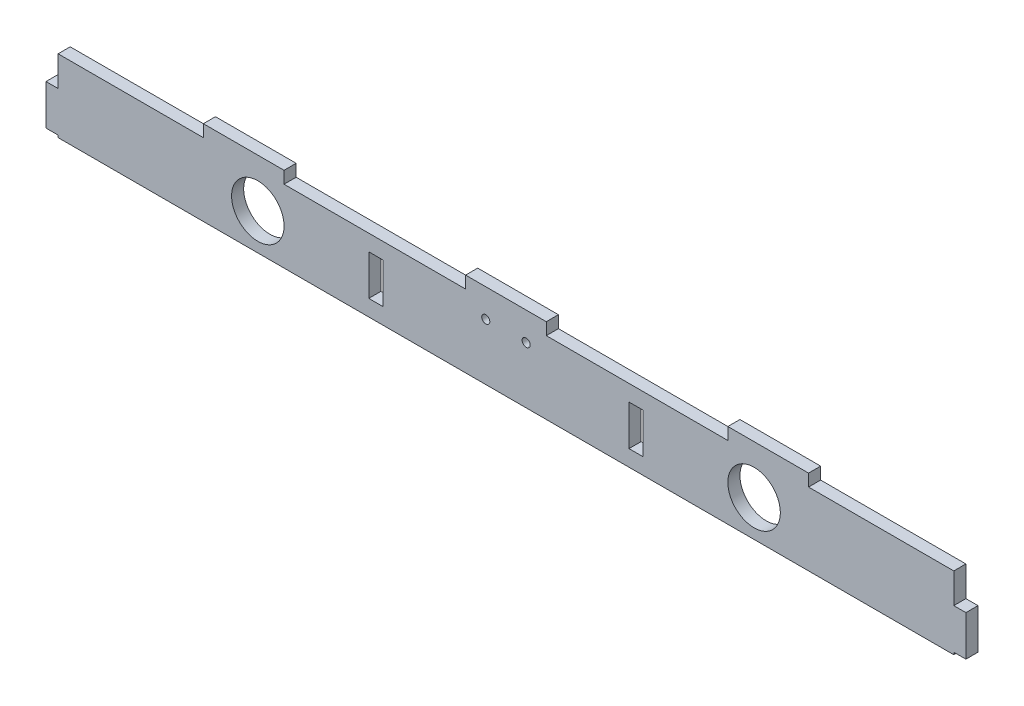
ISO-10303-21;
HEADER;
FILE_DESCRIPTION(('STEP AP214'),'2;1');
FILE_NAME('part.step','',(''),(''),'','','');
FILE_SCHEMA(('AUTOMOTIVE_DESIGN { 1 0 10303 214 1 1 1 1 }'));
ENDSEC;
DATA;
#1=APPLICATION_CONTEXT('core data for automotive mechanical design processes');
#2=APPLICATION_PROTOCOL_DEFINITION('international standard','automotive_design',2000,#1);
#3=PRODUCT_CONTEXT('',#1,'mechanical');
#4=PRODUCT('Part','Part','',(#3));
#5=PRODUCT_RELATED_PRODUCT_CATEGORY('part','',(#4));
#6=PRODUCT_DEFINITION_FORMATION('','',#4);
#7=PRODUCT_DEFINITION_CONTEXT('part definition',#1,'design');
#8=PRODUCT_DEFINITION('design','',#6,#7);
#9=PRODUCT_DEFINITION_SHAPE('','',#8);
#10=(LENGTH_UNIT() NAMED_UNIT(*) SI_UNIT(.MILLI.,.METRE.));
#11=(NAMED_UNIT(*) PLANE_ANGLE_UNIT() SI_UNIT($,.RADIAN.));
#12=(NAMED_UNIT(*) SI_UNIT($,.STERADIAN.) SOLID_ANGLE_UNIT());
#13=UNCERTAINTY_MEASURE_WITH_UNIT(LENGTH_MEASURE(1.E-05),#10,'distance_accuracy_value','');
#14=(GEOMETRIC_REPRESENTATION_CONTEXT(3) GLOBAL_UNCERTAINTY_ASSIGNED_CONTEXT((#13)) GLOBAL_UNIT_ASSIGNED_CONTEXT((#10,
#11,#12)) REPRESENTATION_CONTEXT('',''));
#15=CARTESIAN_POINT('',(0.,0.,0.));
#16=DIRECTION('',(0.,0.,1.));
#17=DIRECTION('',(1.,0.,0.));
#18=AXIS2_PLACEMENT_3D('',#15,#16,#17);
#19=CARTESIAN_POINT('',(-111.,-9.00000000000002,3.));
#20=DIRECTION('',(1.,0.,0.));
#21=DIRECTION('',(0.,0.,-1.));
#22=AXIS2_PLACEMENT_3D('',#19,#20,#21);
#23=PLANE('',#22);
#24=DIRECTION('',(0.,-1.,0.));
#25=VECTOR('',#24,1.);
#26=CARTESIAN_POINT('',(-111.,-9.00000000000002,0.));
#27=LINE('',#26,#25);
#28=CARTESIAN_POINT('',(-111.,8.99999999999998,0.));
#29=VERTEX_POINT('',#28);
#30=CARTESIAN_POINT('',(-111.,1.55,0.));
#31=VERTEX_POINT('',#30);
#32=EDGE_CURVE('E582',#29,#31,#27,.T.);
#33=ORIENTED_EDGE('',*,*,#32,.T.);
#34=DIRECTION('',(0.,0.,1.));
#35=VECTOR('',#34,1.);
#36=CARTESIAN_POINT('',(-111.,1.55,3.));
#37=LINE('',#36,#35);
#38=CARTESIAN_POINT('',(-111.,1.55,3.));
#39=VERTEX_POINT('',#38);
#40=EDGE_CURVE('E274',#31,#39,#37,.T.);
#41=ORIENTED_EDGE('',*,*,#40,.T.);
#42=DIRECTION('',(0.,-1.,0.));
#43=VECTOR('',#42,1.);
#44=CARTESIAN_POINT('',(-111.,-9.00000000000002,3.));
#45=LINE('',#44,#43);
#46=CARTESIAN_POINT('',(-111.,8.99999999999998,3.));
#47=VERTEX_POINT('',#46);
#48=EDGE_CURVE('E563',#47,#39,#45,.T.);
#49=ORIENTED_EDGE('',*,*,#48,.F.);
#50=DIRECTION('',(0.,0.,-1.));
#51=VECTOR('',#50,1.);
#52=CARTESIAN_POINT('',(-111.,8.99999999999998,3.));
#53=LINE('',#52,#51);
#54=EDGE_CURVE('E580',#47,#29,#53,.T.);
#55=ORIENTED_EDGE('',*,*,#54,.T.);
#56=EDGE_LOOP('',(#33,#41,#49,#55));
#57=FACE_BOUND('',#56,.T.);
#58=ADVANCED_FACE('F41',(#57),#23,.F.);
#59=CARTESIAN_POINT('',(111.,-8.99999999999999,3.));
#60=DIRECTION('',(-1.,0.,0.));
#61=DIRECTION('',(0.,0.,1.));
#62=AXIS2_PLACEMENT_3D('',#59,#60,#61);
#63=PLANE('',#62);
#64=DIRECTION('',(0.,0.,-1.));
#65=VECTOR('',#64,1.);
#66=CARTESIAN_POINT('',(111.,-8.45,3.));
#67=LINE('',#66,#65);
#68=CARTESIAN_POINT('',(111.,-8.45,3.));
#69=VERTEX_POINT('',#68);
#70=CARTESIAN_POINT('',(111.,-8.45,0.));
#71=VERTEX_POINT('',#70);
#72=EDGE_CURVE('E65',#69,#71,#67,.T.);
#73=ORIENTED_EDGE('',*,*,#72,.F.);
#74=DIRECTION('',(0.,1.,0.));
#75=VECTOR('',#74,1.);
#76=CARTESIAN_POINT('',(111.,-8.99999999999999,3.));
#77=LINE('',#76,#75);
#78=CARTESIAN_POINT('',(111.,-8.99999999999999,3.));
#79=VERTEX_POINT('',#78);
#80=EDGE_CURVE('E572',#79,#69,#77,.T.);
#81=ORIENTED_EDGE('',*,*,#80,.F.);
#82=DIRECTION('',(0.,0.,-1.));
#83=VECTOR('',#82,1.);
#84=CARTESIAN_POINT('',(111.,-8.99999999999999,3.));
#85=LINE('',#84,#83);
#86=CARTESIAN_POINT('',(111.,-8.99999999999999,0.));
#87=VERTEX_POINT('',#86);
#88=EDGE_CURVE('E50',#79,#87,#85,.T.);
#89=ORIENTED_EDGE('',*,*,#88,.T.);
#90=DIRECTION('',(0.,1.,0.));
#91=VECTOR('',#90,1.);
#92=CARTESIAN_POINT('',(111.,-8.99999999999999,0.));
#93=LINE('',#92,#91);
#94=EDGE_CURVE('E590',#87,#71,#93,.T.);
#95=ORIENTED_EDGE('',*,*,#94,.T.);
#96=EDGE_LOOP('',(#73,#81,#89,#95));
#97=FACE_BOUND('',#96,.T.);
#98=ADVANCED_FACE('F609',(#97),#63,.F.);
#99=DIRECTION('',(0.,0.,1.));
#100=VECTOR('',#99,1.);
#101=CARTESIAN_POINT('',(111.,1.55,3.));
#102=LINE('',#101,#100);
#103=CARTESIAN_POINT('',(111.,1.55,0.));
#104=VERTEX_POINT('',#103);
#105=CARTESIAN_POINT('',(111.,1.55,3.));
#106=VERTEX_POINT('',#105);
#107=EDGE_CURVE('E262',#104,#106,#102,.T.);
#108=ORIENTED_EDGE('',*,*,#107,.F.);
#109=CARTESIAN_POINT('',(111.,9.00000000000001,0.));
#110=VERTEX_POINT('',#109);
#111=EDGE_CURVE('E589',#104,#110,#93,.T.);
#112=ORIENTED_EDGE('',*,*,#111,.T.);
#113=DIRECTION('',(0.,0.,-1.));
#114=VECTOR('',#113,1.);
#115=CARTESIAN_POINT('',(111.,9.00000000000001,3.));
#116=LINE('',#115,#114);
#117=CARTESIAN_POINT('',(111.,9.00000000000001,3.));
#118=VERTEX_POINT('',#117);
#119=EDGE_CURVE('E601',#118,#110,#116,.T.);
#120=ORIENTED_EDGE('',*,*,#119,.F.);
#121=EDGE_CURVE('E571',#106,#118,#77,.T.);
#122=ORIENTED_EDGE('',*,*,#121,.F.);
#123=EDGE_LOOP('',(#108,#112,#120,#122));
#124=FACE_BOUND('',#123,.T.);
#125=ADVANCED_FACE('F797',(#124),#63,.F.);
#126=CARTESIAN_POINT('',(111.,9.00000000000001,3.));
#127=DIRECTION('',(0.,-1.,0.));
#128=DIRECTION('',(1.,0.,0.));
#129=AXIS2_PLACEMENT_3D('',#126,#127,#128);
#130=PLANE('',#129);
#131=DIRECTION('',(0.,0.,1.));
#132=VECTOR('',#131,1.);
#133=CARTESIAN_POINT('',(55.,9.,3.));
#134=LINE('',#133,#132);
#135=CARTESIAN_POINT('',(55.,9.,0.));
#136=VERTEX_POINT('',#135);
#137=CARTESIAN_POINT('',(55.,9.,3.));
#138=VERTEX_POINT('',#137);
#139=EDGE_CURVE('E355',#136,#138,#134,.T.);
#140=ORIENTED_EDGE('',*,*,#139,.F.);
#141=DIRECTION('',(-1.,0.,0.));
#142=VECTOR('',#141,1.);
#143=CARTESIAN_POINT('',(111.,9.00000000000001,0.));
#144=LINE('',#143,#142);
#145=CARTESIAN_POINT('',(10.,9.,0.));
#146=VERTEX_POINT('',#145);
#147=EDGE_CURVE('E597',#136,#146,#144,.T.);
#148=ORIENTED_EDGE('',*,*,#147,.T.);
#149=DIRECTION('',(0.,0.,-1.));
#150=VECTOR('',#149,1.);
#151=CARTESIAN_POINT('',(10.,9.,3.));
#152=LINE('',#151,#150);
#153=CARTESIAN_POINT('',(10.,9.,3.));
#154=VERTEX_POINT('',#153);
#155=EDGE_CURVE('E388',#154,#146,#152,.T.);
#156=ORIENTED_EDGE('',*,*,#155,.F.);
#157=DIRECTION('',(-1.,0.,0.));
#158=VECTOR('',#157,1.);
#159=CARTESIAN_POINT('',(111.,9.00000000000001,3.));
#160=LINE('',#159,#158);
#161=EDGE_CURVE('E581',#138,#154,#160,.T.);
#162=ORIENTED_EDGE('',*,*,#161,.F.);
#163=EDGE_LOOP('',(#140,#148,#156,#162));
#164=FACE_BOUND('',#163,.T.);
#165=ADVANCED_FACE('F745',(#164),#130,.F.);
#166=DIRECTION('',(0.,0.,-1.));
#167=VECTOR('',#166,1.);
#168=CARTESIAN_POINT('',(75.,9.00000000000001,3.));
#169=LINE('',#168,#167);
#170=CARTESIAN_POINT('',(75.0000000000001,9.00000000000001,3.));
#171=VERTEX_POINT('',#170);
#172=CARTESIAN_POINT('',(75.0000000000001,9.00000000000001,0.));
#173=VERTEX_POINT('',#172);
#174=EDGE_CURVE('E351',#171,#173,#169,.T.);
#175=ORIENTED_EDGE('',*,*,#174,.F.);
#176=EDGE_CURVE('E576',#118,#171,#160,.T.);
#177=ORIENTED_EDGE('',*,*,#176,.F.);
#178=ORIENTED_EDGE('',*,*,#119,.T.);
#179=EDGE_CURVE('E594',#110,#173,#144,.T.);
#180=ORIENTED_EDGE('',*,*,#179,.T.);
#181=EDGE_LOOP('',(#175,#177,#178,#180));
#182=FACE_BOUND('',#181,.T.);
#183=ADVANCED_FACE('F815',(#182),#130,.F.);
#184=DIRECTION('',(0.,0.,1.));
#185=VECTOR('',#184,1.);
#186=CARTESIAN_POINT('',(-9.99999999999997,8.99999999999999,3.));
#187=LINE('',#186,#185);
#188=CARTESIAN_POINT('',(-9.99999999999997,8.99999999999999,0.));
#189=VERTEX_POINT('',#188);
#190=CARTESIAN_POINT('',(-9.99999999999997,8.99999999999999,3.));
#191=VERTEX_POINT('',#190);
#192=EDGE_CURVE('E392',#189,#191,#187,.T.);
#193=ORIENTED_EDGE('',*,*,#192,.F.);
#194=CARTESIAN_POINT('',(-55.,8.99999999999999,0.));
#195=VERTEX_POINT('',#194);
#196=EDGE_CURVE('E715',#189,#195,#144,.T.);
#197=ORIENTED_EDGE('',*,*,#196,.T.);
#198=DIRECTION('',(0.,0.,-1.));
#199=VECTOR('',#198,1.);
#200=CARTESIAN_POINT('',(-55.,8.99999999999999,3.));
#201=LINE('',#200,#199);
#202=CARTESIAN_POINT('',(-55.,8.99999999999999,3.));
#203=VERTEX_POINT('',#202);
#204=EDGE_CURVE('E414',#203,#195,#201,.T.);
#205=ORIENTED_EDGE('',*,*,#204,.F.);
#206=EDGE_CURVE('E730',#191,#203,#160,.T.);
#207=ORIENTED_EDGE('',*,*,#206,.F.);
#208=EDGE_LOOP('',(#193,#197,#205,#207));
#209=FACE_BOUND('',#208,.T.);
#210=ADVANCED_FACE('F760',(#209),#130,.F.);
#211=DIRECTION('',(0.,0.,1.));
#212=VECTOR('',#211,1.);
#213=CARTESIAN_POINT('',(-75.,8.99999999999999,3.));
#214=LINE('',#213,#212);
#215=CARTESIAN_POINT('',(-75.,8.99999999999999,0.));
#216=VERTEX_POINT('',#215);
#217=CARTESIAN_POINT('',(-75.,8.99999999999999,3.));
#218=VERTEX_POINT('',#217);
#219=EDGE_CURVE('E397',#216,#218,#214,.T.);
#220=ORIENTED_EDGE('',*,*,#219,.F.);
#221=EDGE_CURVE('E593',#216,#29,#144,.T.);
#222=ORIENTED_EDGE('',*,*,#221,.T.);
#223=ORIENTED_EDGE('',*,*,#54,.F.);
#224=EDGE_CURVE('E575',#218,#47,#160,.T.);
#225=ORIENTED_EDGE('',*,*,#224,.F.);
#226=EDGE_LOOP('',(#220,#222,#223,#225));
#227=FACE_BOUND('',#226,.T.);
#228=ADVANCED_FACE('F775',(#227),#130,.F.);
#229=CARTESIAN_POINT('',(0.,0.,3.));
#230=DIRECTION('',(0.,0.,1.));
#231=DIRECTION('',(1.,0.,0.));
#232=AXIS2_PLACEMENT_3D('',#229,#230,#231);
#233=PLANE('',#232);
#234=DIRECTION('',(-1.,0.,0.));
#235=VECTOR('',#234,1.);
#236=CARTESIAN_POINT('',(34.,5.0000000000001,3.));
#237=LINE('',#236,#235);
#238=CARTESIAN_POINT('',(34.,5.0000000000001,3.));
#239=VERTEX_POINT('',#238);
#240=CARTESIAN_POINT('',(30.5,5.0000000000001,3.));
#241=VERTEX_POINT('',#240);
#242=EDGE_CURVE('E457',#239,#241,#237,.T.);
#243=ORIENTED_EDGE('',*,*,#242,.F.);
#244=DIRECTION('',(0.,1.,0.));
#245=VECTOR('',#244,1.);
#246=CARTESIAN_POINT('',(34.,5.0000000000001,3.));
#247=LINE('',#246,#245);
#248=CARTESIAN_POINT('',(34.,-4.9999999999999,3.));
#249=VERTEX_POINT('',#248);
#250=EDGE_CURVE('E454',#249,#239,#247,.T.);
#251=ORIENTED_EDGE('',*,*,#250,.F.);
#252=DIRECTION('',(1.,0.,0.));
#253=VECTOR('',#252,1.);
#254=CARTESIAN_POINT('',(34.,-4.9999999999999,3.));
#255=LINE('',#254,#253);
#256=CARTESIAN_POINT('',(30.5,-4.99999999999991,3.));
#257=VERTEX_POINT('',#256);
#258=EDGE_CURVE('E465',#257,#249,#255,.T.);
#259=ORIENTED_EDGE('',*,*,#258,.F.);
#260=DIRECTION('',(0.,-1.,0.));
#261=VECTOR('',#260,1.);
#262=CARTESIAN_POINT('',(30.5,5.0000000000001,3.));
#263=LINE('',#262,#261);
#264=EDGE_CURVE('E461',#241,#257,#263,.T.);
#265=ORIENTED_EDGE('',*,*,#264,.F.);
#266=EDGE_LOOP('',(#243,#251,#259,#265));
#267=FACE_BOUND('',#266,.T.);
#268=CARTESIAN_POINT('',(5.00000000000002,5.00000000000002,3.));
#269=DIRECTION('',(0.,0.,1.));
#270=DIRECTION('',(-1.,0.,0.));
#271=AXIS2_PLACEMENT_3D('',#268,#269,#270);
#272=CIRCLE('',#271,0.999999999999999);
#273=CARTESIAN_POINT('',(4.00000000000002,5.00000000000002,3.));
#274=VERTEX_POINT('',#273);
#275=EDGE_CURVE('E497',#274,#274,#272,.T.);
#276=ORIENTED_EDGE('',*,*,#275,.F.);
#277=EDGE_LOOP('',(#276));
#278=FACE_BOUND('',#277,.T.);
#279=DIRECTION('',(-1.,0.,0.));
#280=VECTOR('',#279,1.);
#281=CARTESIAN_POINT('',(-34.,5.,3.));
#282=LINE('',#281,#280);
#283=CARTESIAN_POINT('',(-30.5,5.,3.));
#284=VERTEX_POINT('',#283);
#285=CARTESIAN_POINT('',(-34.,5.,3.));
#286=VERTEX_POINT('',#285);
#287=EDGE_CURVE('E516',#284,#286,#282,.T.);
#288=ORIENTED_EDGE('',*,*,#287,.F.);
#289=DIRECTION('',(0.,1.,0.));
#290=VECTOR('',#289,1.);
#291=CARTESIAN_POINT('',(-30.5,5.,3.));
#292=LINE('',#291,#290);
#293=CARTESIAN_POINT('',(-30.5,-5.,3.));
#294=VERTEX_POINT('',#293);
#295=EDGE_CURVE('E513',#294,#284,#292,.T.);
#296=ORIENTED_EDGE('',*,*,#295,.F.);
#297=DIRECTION('',(1.,0.,0.));
#298=VECTOR('',#297,1.);
#299=CARTESIAN_POINT('',(-34.,-5.,3.));
#300=LINE('',#299,#298);
#301=CARTESIAN_POINT('',(-34.,-5.,3.));
#302=VERTEX_POINT('',#301);
#303=EDGE_CURVE('E524',#302,#294,#300,.T.);
#304=ORIENTED_EDGE('',*,*,#303,.F.);
#305=DIRECTION('',(0.,-1.,0.));
#306=VECTOR('',#305,1.);
#307=CARTESIAN_POINT('',(-34.,5.,3.));
#308=LINE('',#307,#306);
#309=EDGE_CURVE('E520',#286,#302,#308,.T.);
#310=ORIENTED_EDGE('',*,*,#309,.F.);
#311=EDGE_LOOP('',(#288,#296,#304,#310));
#312=FACE_BOUND('',#311,.T.);
#313=CARTESIAN_POINT('',(-5.,5.,3.));
#314=DIRECTION('',(0.,0.,1.));
#315=DIRECTION('',(1.,0.,0.));
#316=AXIS2_PLACEMENT_3D('',#313,#314,#315);
#317=CIRCLE('',#316,1.);
#318=CARTESIAN_POINT('',(-4.,5.,3.));
#319=VERTEX_POINT('',#318);
#320=EDGE_CURVE('E556',#319,#319,#317,.T.);
#321=ORIENTED_EDGE('',*,*,#320,.F.);
#322=EDGE_LOOP('',(#321));
#323=FACE_BOUND('',#322,.T.);
#324=ORIENTED_EDGE('',*,*,#48,.T.);
#325=DIRECTION('',(1.,0.,0.));
#326=VECTOR('',#325,1.);
#327=CARTESIAN_POINT('',(-114.,1.55,3.));
#328=LINE('',#327,#326);
#329=CARTESIAN_POINT('',(-114.,1.55,3.));
#330=VERTEX_POINT('',#329);
#331=EDGE_CURVE('E295',#330,#39,#328,.T.);
#332=ORIENTED_EDGE('',*,*,#331,.F.);
#333=DIRECTION('',(0.,-1.,0.));
#334=VECTOR('',#333,1.);
#335=CARTESIAN_POINT('',(-114.,-8.45,3.));
#336=LINE('',#335,#334);
#337=CARTESIAN_POINT('',(-114.,-8.45,3.));
#338=VERTEX_POINT('',#337);
#339=EDGE_CURVE('E278',#330,#338,#336,.T.);
#340=ORIENTED_EDGE('',*,*,#339,.T.);
#341=DIRECTION('',(1.,0.,0.));
#342=VECTOR('',#341,1.);
#343=CARTESIAN_POINT('',(-114.,-8.45,3.));
#344=LINE('',#343,#342);
#345=CARTESIAN_POINT('',(-111.,-8.45,3.));
#346=VERTEX_POINT('',#345);
#347=EDGE_CURVE('E263',#338,#346,#344,.T.);
#348=ORIENTED_EDGE('',*,*,#347,.T.);
#349=CARTESIAN_POINT('',(-111.,-9.00000000000002,3.));
#350=VERTEX_POINT('',#349);
#351=EDGE_CURVE('E568',#346,#350,#45,.T.);
#352=ORIENTED_EDGE('',*,*,#351,.T.);
#353=DIRECTION('',(1.,0.,0.));
#354=VECTOR('',#353,1.);
#355=CARTESIAN_POINT('',(111.,-8.99999999999999,3.));
#356=LINE('',#355,#354);
#357=EDGE_CURVE('E567',#350,#79,#356,.T.);
#358=ORIENTED_EDGE('',*,*,#357,.T.);
#359=ORIENTED_EDGE('',*,*,#80,.T.);
#360=DIRECTION('',(-1.,0.,0.));
#361=VECTOR('',#360,1.);
#362=CARTESIAN_POINT('',(114.,-8.45,3.));
#363=LINE('',#362,#361);
#364=CARTESIAN_POINT('',(114.,-8.45,3.));
#365=VERTEX_POINT('',#364);
#366=EDGE_CURVE('E322',#365,#69,#363,.T.);
#367=ORIENTED_EDGE('',*,*,#366,.F.);
#368=DIRECTION('',(0.,-1.,0.));
#369=VECTOR('',#368,1.);
#370=CARTESIAN_POINT('',(114.,-8.45,3.));
#371=LINE('',#370,#369);
#372=CARTESIAN_POINT('',(114.,1.55,3.));
#373=VERTEX_POINT('',#372);
#374=EDGE_CURVE('E307',#373,#365,#371,.T.);
#375=ORIENTED_EDGE('',*,*,#374,.F.);
#376=DIRECTION('',(-1.,0.,0.));
#377=VECTOR('',#376,1.);
#378=CARTESIAN_POINT('',(114.,1.55,3.));
#379=LINE('',#378,#377);
#380=EDGE_CURVE('E326',#373,#106,#379,.T.);
#381=ORIENTED_EDGE('',*,*,#380,.T.);
#382=ORIENTED_EDGE('',*,*,#121,.T.);
#383=ORIENTED_EDGE('',*,*,#176,.T.);
#384=DIRECTION('',(0.,-1.,0.));
#385=VECTOR('',#384,1.);
#386=CARTESIAN_POINT('',(75.,12.,3.));
#387=LINE('',#386,#385);
#388=CARTESIAN_POINT('',(75.,12.,3.));
#389=VERTEX_POINT('',#388);
#390=EDGE_CURVE('E342',#389,#171,#387,.T.);
#391=ORIENTED_EDGE('',*,*,#390,.F.);
#392=DIRECTION('',(1.,0.,0.));
#393=VECTOR('',#392,1.);
#394=CARTESIAN_POINT('',(75.,12.,3.));
#395=LINE('',#394,#393);
#396=CARTESIAN_POINT('',(55.,12.,3.));
#397=VERTEX_POINT('',#396);
#398=EDGE_CURVE('E363',#397,#389,#395,.T.);
#399=ORIENTED_EDGE('',*,*,#398,.F.);
#400=DIRECTION('',(0.,-1.,0.));
#401=VECTOR('',#400,1.);
#402=CARTESIAN_POINT('',(55.,12.,3.));
#403=LINE('',#402,#401);
#404=EDGE_CURVE('E338',#397,#138,#403,.T.);
#405=ORIENTED_EDGE('',*,*,#404,.T.);
#406=ORIENTED_EDGE('',*,*,#161,.T.);
#407=DIRECTION('',(0.,-1.,0.));
#408=VECTOR('',#407,1.);
#409=CARTESIAN_POINT('',(10.,12.,3.));
#410=LINE('',#409,#408);
#411=CARTESIAN_POINT('',(10.,12.,3.));
#412=VERTEX_POINT('',#411);
#413=EDGE_CURVE('E379',#412,#154,#410,.T.);
#414=ORIENTED_EDGE('',*,*,#413,.F.);
#415=DIRECTION('',(1.,0.,0.));
#416=VECTOR('',#415,1.);
#417=CARTESIAN_POINT('',(10.,12.,3.));
#418=LINE('',#417,#416);
#419=CARTESIAN_POINT('',(-9.99999999999997,12.,3.));
#420=VERTEX_POINT('',#419);
#421=EDGE_CURVE('E400',#420,#412,#418,.T.);
#422=ORIENTED_EDGE('',*,*,#421,.F.);
#423=DIRECTION('',(0.,-1.,0.));
#424=VECTOR('',#423,1.);
#425=CARTESIAN_POINT('',(-9.99999999999997,12.,3.));
#426=LINE('',#425,#424);
#427=EDGE_CURVE('E375',#420,#191,#426,.T.);
#428=ORIENTED_EDGE('',*,*,#427,.T.);
#429=ORIENTED_EDGE('',*,*,#206,.T.);
#430=DIRECTION('',(0.,-1.,0.));
#431=VECTOR('',#430,1.);
#432=CARTESIAN_POINT('',(-55.,12.,3.));
#433=LINE('',#432,#431);
#434=CARTESIAN_POINT('',(-55.,12.,3.));
#435=VERTEX_POINT('',#434);
#436=EDGE_CURVE('E433',#435,#203,#433,.T.);
#437=ORIENTED_EDGE('',*,*,#436,.F.);
#438=DIRECTION('',(1.,0.,0.));
#439=VECTOR('',#438,1.);
#440=CARTESIAN_POINT('',(-55.,12.,3.));
#441=LINE('',#440,#439);
#442=CARTESIAN_POINT('',(-75.,12.,3.));
#443=VERTEX_POINT('',#442);
#444=EDGE_CURVE('E417',#443,#435,#441,.T.);
#445=ORIENTED_EDGE('',*,*,#444,.F.);
#446=DIRECTION('',(0.,-1.,0.));
#447=VECTOR('',#446,1.);
#448=CARTESIAN_POINT('',(-75.,12.,3.));
#449=LINE('',#448,#447);
#450=EDGE_CURVE('E437',#443,#218,#449,.T.);
#451=ORIENTED_EDGE('',*,*,#450,.T.);
#452=ORIENTED_EDGE('',*,*,#224,.T.);
#453=EDGE_LOOP('',(#324,#332,#340,#348,#352,#358,#359,#367,#375,#381,#382,#383,#391,#399,#405,
#406,#414,#422,#428,#429,#437,#445,#451,#452));
#454=FACE_BOUND('',#453,.T.);
#455=CARTESIAN_POINT('',(-61.5,0.,3.));
#456=DIRECTION('',(0.,0.,1.));
#457=DIRECTION('',(1.,0.,0.));
#458=AXIS2_PLACEMENT_3D('',#455,#456,#457);
#459=CIRCLE('',#458,6.5);
#460=CARTESIAN_POINT('',(-55.,0.,3.));
#461=VERTEX_POINT('',#460);
#462=EDGE_CURVE('E505',#461,#461,#459,.T.);
#463=ORIENTED_EDGE('',*,*,#462,.F.);
#464=EDGE_LOOP('',(#463));
#465=FACE_BOUND('',#464,.T.);
#466=CARTESIAN_POINT('',(61.5,1.89663100040131E-13,3.));
#467=DIRECTION('',(0.,0.,1.));
#468=DIRECTION('',(-1.,0.,0.));
#469=AXIS2_PLACEMENT_3D('',#466,#467,#468);
#470=CIRCLE('',#469,6.5);
#471=CARTESIAN_POINT('',(55.,1.89663100040131E-13,3.));
#472=VERTEX_POINT('',#471);
#473=EDGE_CURVE('E446',#472,#472,#470,.T.);
#474=ORIENTED_EDGE('',*,*,#473,.F.);
#475=EDGE_LOOP('',(#474));
#476=FACE_BOUND('',#475,.T.);
#477=ADVANCED_FACE('F621',(#267,#278,#312,#323,#454,#465,#476),#233,.T.);
#478=CARTESIAN_POINT('',(0.,0.,0.));
#479=DIRECTION('',(0.,0.,1.));
#480=DIRECTION('',(1.,0.,0.));
#481=AXIS2_PLACEMENT_3D('',#478,#479,#480);
#482=PLANE('',#481);
#483=CARTESIAN_POINT('',(5.00000000000002,5.00000000000002,0.));
#484=DIRECTION('',(0.,0.,1.));
#485=DIRECTION('',(-1.,0.,0.));
#486=AXIS2_PLACEMENT_3D('',#483,#484,#485);
#487=CIRCLE('',#486,0.999999999999999);
#488=CARTESIAN_POINT('',(4.00000000000002,5.00000000000002,0.));
#489=VERTEX_POINT('',#488);
#490=EDGE_CURVE('E496',#489,#489,#487,.T.);
#491=ORIENTED_EDGE('',*,*,#490,.T.);
#492=EDGE_LOOP('',(#491));
#493=FACE_BOUND('',#492,.T.);
#494=CARTESIAN_POINT('',(-61.5,0.,0.));
#495=DIRECTION('',(0.,0.,1.));
#496=DIRECTION('',(1.,0.,0.));
#497=AXIS2_PLACEMENT_3D('',#494,#495,#496);
#498=CIRCLE('',#497,6.5);
#499=CARTESIAN_POINT('',(-55.,0.,0.));
#500=VERTEX_POINT('',#499);
#501=EDGE_CURVE('E501',#500,#500,#498,.T.);
#502=ORIENTED_EDGE('',*,*,#501,.T.);
#503=EDGE_LOOP('',(#502));
#504=FACE_BOUND('',#503,.T.);
#505=DIRECTION('',(0.,1.,0.));
#506=VECTOR('',#505,1.);
#507=CARTESIAN_POINT('',(-30.5,5.,0.));
#508=LINE('',#507,#506);
#509=CARTESIAN_POINT('',(-30.5,-5.,0.));
#510=VERTEX_POINT('',#509);
#511=CARTESIAN_POINT('',(-30.5,5.,0.));
#512=VERTEX_POINT('',#511);
#513=EDGE_CURVE('E509',#510,#512,#508,.T.);
#514=ORIENTED_EDGE('',*,*,#513,.T.);
#515=DIRECTION('',(-1.,0.,0.));
#516=VECTOR('',#515,1.);
#517=CARTESIAN_POINT('',(-34.,5.,0.));
#518=LINE('',#517,#516);
#519=CARTESIAN_POINT('',(-34.,5.,0.));
#520=VERTEX_POINT('',#519);
#521=EDGE_CURVE('E531',#512,#520,#518,.T.);
#522=ORIENTED_EDGE('',*,*,#521,.T.);
#523=DIRECTION('',(0.,-1.,0.));
#524=VECTOR('',#523,1.);
#525=CARTESIAN_POINT('',(-34.,5.,0.));
#526=LINE('',#525,#524);
#527=CARTESIAN_POINT('',(-34.,-5.,0.));
#528=VERTEX_POINT('',#527);
#529=EDGE_CURVE('E535',#520,#528,#526,.T.);
#530=ORIENTED_EDGE('',*,*,#529,.T.);
#531=DIRECTION('',(1.,0.,0.));
#532=VECTOR('',#531,1.);
#533=CARTESIAN_POINT('',(-34.,-5.,0.));
#534=LINE('',#533,#532);
#535=EDGE_CURVE('E517',#528,#510,#534,.T.);
#536=ORIENTED_EDGE('',*,*,#535,.T.);
#537=EDGE_LOOP('',(#514,#522,#530,#536));
#538=FACE_BOUND('',#537,.T.);
#539=ORIENTED_EDGE('',*,*,#32,.F.);
#540=ORIENTED_EDGE('',*,*,#221,.F.);
#541=DIRECTION('',(0.,-1.,0.));
#542=VECTOR('',#541,1.);
#543=CARTESIAN_POINT('',(-75.,12.,0.));
#544=LINE('',#543,#542);
#545=CARTESIAN_POINT('',(-75.,12.,0.));
#546=VERTEX_POINT('',#545);
#547=EDGE_CURVE('E441',#546,#216,#544,.T.);
#548=ORIENTED_EDGE('',*,*,#547,.F.);
#549=DIRECTION('',(-1.,0.,0.));
#550=VECTOR('',#549,1.);
#551=CARTESIAN_POINT('',(-55.,12.,0.));
#552=LINE('',#551,#550);
#553=CARTESIAN_POINT('',(-55.,12.,0.));
#554=VERTEX_POINT('',#553);
#555=EDGE_CURVE('E409',#554,#546,#552,.T.);
#556=ORIENTED_EDGE('',*,*,#555,.F.);
#557=DIRECTION('',(0.,-1.,0.));
#558=VECTOR('',#557,1.);
#559=CARTESIAN_POINT('',(-55.,12.,0.));
#560=LINE('',#559,#558);
#561=EDGE_CURVE('E423',#554,#195,#560,.T.);
#562=ORIENTED_EDGE('',*,*,#561,.T.);
#563=ORIENTED_EDGE('',*,*,#196,.F.);
#564=DIRECTION('',(0.,-1.,0.));
#565=VECTOR('',#564,1.);
#566=CARTESIAN_POINT('',(-9.99999999999997,12.,0.));
#567=LINE('',#566,#565);
#568=CARTESIAN_POINT('',(-9.99999999999997,12.,0.));
#569=VERTEX_POINT('',#568);
#570=EDGE_CURVE('E360',#569,#189,#567,.T.);
#571=ORIENTED_EDGE('',*,*,#570,.F.);
#572=DIRECTION('',(-1.,0.,0.));
#573=VECTOR('',#572,1.);
#574=CARTESIAN_POINT('',(10.,12.,0.));
#575=LINE('',#574,#573);
#576=CARTESIAN_POINT('',(10.,12.,0.));
#577=VERTEX_POINT('',#576);
#578=EDGE_CURVE('E393',#577,#569,#575,.T.);
#579=ORIENTED_EDGE('',*,*,#578,.F.);
#580=DIRECTION('',(0.,-1.,0.));
#581=VECTOR('',#580,1.);
#582=CARTESIAN_POINT('',(10.,12.,0.));
#583=LINE('',#582,#581);
#584=EDGE_CURVE('E383',#577,#146,#583,.T.);
#585=ORIENTED_EDGE('',*,*,#584,.T.);
#586=ORIENTED_EDGE('',*,*,#147,.F.);
#587=DIRECTION('',(0.,-1.,0.));
#588=VECTOR('',#587,1.);
#589=CARTESIAN_POINT('',(55.,12.,0.));
#590=LINE('',#589,#588);
#591=CARTESIAN_POINT('',(55.,12.,0.));
#592=VERTEX_POINT('',#591);
#593=EDGE_CURVE('E334',#592,#136,#590,.T.);
#594=ORIENTED_EDGE('',*,*,#593,.F.);
#595=DIRECTION('',(-1.,0.,0.));
#596=VECTOR('',#595,1.);
#597=CARTESIAN_POINT('',(75.0000000000001,12.,0.));
#598=LINE('',#597,#596);
#599=CARTESIAN_POINT('',(75.0000000000001,12.,0.));
#600=VERTEX_POINT('',#599);
#601=EDGE_CURVE('E356',#600,#592,#598,.T.);
#602=ORIENTED_EDGE('',*,*,#601,.F.);
#603=DIRECTION('',(0.,-1.,0.));
#604=VECTOR('',#603,1.);
#605=CARTESIAN_POINT('',(75.0000000000001,12.,0.));
#606=LINE('',#605,#604);
#607=EDGE_CURVE('E346',#600,#173,#606,.T.);
#608=ORIENTED_EDGE('',*,*,#607,.T.);
#609=ORIENTED_EDGE('',*,*,#179,.F.);
#610=ORIENTED_EDGE('',*,*,#111,.F.);
#611=DIRECTION('',(-1.,0.,0.));
#612=VECTOR('',#611,1.);
#613=CARTESIAN_POINT('',(114.,1.55,0.));
#614=LINE('',#613,#612);
#615=CARTESIAN_POINT('',(114.,1.55,0.));
#616=VERTEX_POINT('',#615);
#617=EDGE_CURVE('E330',#616,#104,#614,.T.);
#618=ORIENTED_EDGE('',*,*,#617,.F.);
#619=DIRECTION('',(0.,1.,0.));
#620=VECTOR('',#619,1.);
#621=CARTESIAN_POINT('',(114.,-8.45,0.));
#622=LINE('',#621,#620);
#623=CARTESIAN_POINT('',(114.,-8.45,0.));
#624=VERTEX_POINT('',#623);
#625=EDGE_CURVE('E300',#624,#616,#622,.T.);
#626=ORIENTED_EDGE('',*,*,#625,.F.);
#627=DIRECTION('',(-1.,0.,0.));
#628=VECTOR('',#627,1.);
#629=CARTESIAN_POINT('',(114.,-8.45,0.));
#630=LINE('',#629,#628);
#631=EDGE_CURVE('E313',#624,#71,#630,.T.);
#632=ORIENTED_EDGE('',*,*,#631,.T.);
#633=ORIENTED_EDGE('',*,*,#94,.F.);
#634=DIRECTION('',(1.,0.,0.));
#635=VECTOR('',#634,1.);
#636=CARTESIAN_POINT('',(111.,-8.99999999999999,0.));
#637=LINE('',#636,#635);
#638=CARTESIAN_POINT('',(-111.,-9.00000000000002,0.));
#639=VERTEX_POINT('',#638);
#640=EDGE_CURVE('E586',#639,#87,#637,.T.);
#641=ORIENTED_EDGE('',*,*,#640,.F.);
#642=CARTESIAN_POINT('',(-111.,-8.45,0.));
#643=VERTEX_POINT('',#642);
#644=EDGE_CURVE('E260',#643,#639,#27,.T.);
#645=ORIENTED_EDGE('',*,*,#644,.F.);
#646=DIRECTION('',(1.,0.,0.));
#647=VECTOR('',#646,1.);
#648=CARTESIAN_POINT('',(-114.,-8.45,0.));
#649=LINE('',#648,#647);
#650=CARTESIAN_POINT('',(-114.,-8.45,0.));
#651=VERTEX_POINT('',#650);
#652=EDGE_CURVE('E57',#651,#643,#649,.T.);
#653=ORIENTED_EDGE('',*,*,#652,.F.);
#654=DIRECTION('',(0.,1.,0.));
#655=VECTOR('',#654,1.);
#656=CARTESIAN_POINT('',(-114.,-8.45,0.));
#657=LINE('',#656,#655);
#658=CARTESIAN_POINT('',(-114.,1.55,0.));
#659=VERTEX_POINT('',#658);
#660=EDGE_CURVE('E257',#651,#659,#657,.T.);
#661=ORIENTED_EDGE('',*,*,#660,.T.);
#662=DIRECTION('',(1.,0.,0.));
#663=VECTOR('',#662,1.);
#664=CARTESIAN_POINT('',(-114.,1.55,0.));
#665=LINE('',#664,#663);
#666=EDGE_CURVE('E286',#659,#31,#665,.T.);
#667=ORIENTED_EDGE('',*,*,#666,.T.);
#668=EDGE_LOOP('',(#539,#540,#548,#556,#562,#563,#571,#579,#585,#586,#594,#602,#608,#609,#610,
#618,#626,#632,#633,#641,#645,#653,#661,#667));
#669=FACE_BOUND('',#668,.T.);
#670=CARTESIAN_POINT('',(-5.,5.,0.));
#671=DIRECTION('',(0.,0.,1.));
#672=DIRECTION('',(1.,0.,0.));
#673=AXIS2_PLACEMENT_3D('',#670,#671,#672);
#674=CIRCLE('',#673,1.);
#675=CARTESIAN_POINT('',(-4.,5.,0.));
#676=VERTEX_POINT('',#675);
#677=EDGE_CURVE('E555',#676,#676,#674,.T.);
#678=ORIENTED_EDGE('',*,*,#677,.T.);
#679=EDGE_LOOP('',(#678));
#680=FACE_BOUND('',#679,.T.);
#681=DIRECTION('',(0.,1.,0.));
#682=VECTOR('',#681,1.);
#683=CARTESIAN_POINT('',(34.,5.0000000000001,0.));
#684=LINE('',#683,#682);
#685=CARTESIAN_POINT('',(34.,-4.9999999999999,0.));
#686=VERTEX_POINT('',#685);
#687=CARTESIAN_POINT('',(34.,5.0000000000001,0.));
#688=VERTEX_POINT('',#687);
#689=EDGE_CURVE('E450',#686,#688,#684,.T.);
#690=ORIENTED_EDGE('',*,*,#689,.T.);
#691=DIRECTION('',(-1.,0.,0.));
#692=VECTOR('',#691,1.);
#693=CARTESIAN_POINT('',(34.,5.0000000000001,0.));
#694=LINE('',#693,#692);
#695=CARTESIAN_POINT('',(30.5,5.0000000000001,0.));
#696=VERTEX_POINT('',#695);
#697=EDGE_CURVE('E472',#688,#696,#694,.T.);
#698=ORIENTED_EDGE('',*,*,#697,.T.);
#699=DIRECTION('',(0.,-1.,0.));
#700=VECTOR('',#699,1.);
#701=CARTESIAN_POINT('',(30.5,5.0000000000001,0.));
#702=LINE('',#701,#700);
#703=CARTESIAN_POINT('',(30.5,-4.99999999999991,0.));
#704=VERTEX_POINT('',#703);
#705=EDGE_CURVE('E476',#696,#704,#702,.T.);
#706=ORIENTED_EDGE('',*,*,#705,.T.);
#707=DIRECTION('',(1.,0.,0.));
#708=VECTOR('',#707,1.);
#709=CARTESIAN_POINT('',(34.,-4.9999999999999,0.));
#710=LINE('',#709,#708);
#711=EDGE_CURVE('E458',#704,#686,#710,.T.);
#712=ORIENTED_EDGE('',*,*,#711,.T.);
#713=EDGE_LOOP('',(#690,#698,#706,#712));
#714=FACE_BOUND('',#713,.T.);
#715=CARTESIAN_POINT('',(61.5,1.89663100040131E-13,0.));
#716=DIRECTION('',(0.,0.,1.));
#717=DIRECTION('',(-1.,0.,0.));
#718=AXIS2_PLACEMENT_3D('',#715,#716,#717);
#719=CIRCLE('',#718,6.5);
#720=CARTESIAN_POINT('',(55.,1.89663100040131E-13,0.));
#721=VERTEX_POINT('',#720);
#722=EDGE_CURVE('E445',#721,#721,#719,.T.);
#723=ORIENTED_EDGE('',*,*,#722,.T.);
#724=EDGE_LOOP('',(#723));
#725=FACE_BOUND('',#724,.T.);
#726=ADVANCED_FACE('F255',(#493,#504,#538,#669,#680,#714,#725),#482,.F.);
#727=ORIENTED_EDGE('',*,*,#351,.F.);
#728=DIRECTION('',(0.,0.,-1.));
#729=VECTOR('',#728,1.);
#730=CARTESIAN_POINT('',(-111.,-8.45,3.));
#731=LINE('',#730,#729);
#732=EDGE_CURVE('E287',#346,#643,#731,.T.);
#733=ORIENTED_EDGE('',*,*,#732,.T.);
#734=ORIENTED_EDGE('',*,*,#644,.T.);
#735=DIRECTION('',(0.,0.,-1.));
#736=VECTOR('',#735,1.);
#737=CARTESIAN_POINT('',(-111.,-9.00000000000002,3.));
#738=LINE('',#737,#736);
#739=EDGE_CURVE('E11',#350,#639,#738,.T.);
#740=ORIENTED_EDGE('',*,*,#739,.F.);
#741=EDGE_LOOP('',(#727,#733,#734,#740));
#742=FACE_BOUND('',#741,.T.);
#743=ADVANCED_FACE('F43',(#742),#23,.F.);
#744=CARTESIAN_POINT('',(111.,-8.99999999999999,3.));
#745=DIRECTION('',(0.,1.,0.));
#746=DIRECTION('',(-1.,0.,0.));
#747=AXIS2_PLACEMENT_3D('',#744,#745,#746);
#748=PLANE('',#747);
#749=ORIENTED_EDGE('',*,*,#640,.T.);
#750=ORIENTED_EDGE('',*,*,#88,.F.);
#751=ORIENTED_EDGE('',*,*,#357,.F.);
#752=ORIENTED_EDGE('',*,*,#739,.T.);
#753=EDGE_LOOP('',(#749,#750,#751,#752));
#754=FACE_BOUND('',#753,.T.);
#755=ADVANCED_FACE('F625',(#754),#748,.F.);
#756=CARTESIAN_POINT('',(-5.,5.,3.));
#757=DIRECTION('',(0.,0.,-1.));
#758=DIRECTION('',(-1.,0.,0.));
#759=AXIS2_PLACEMENT_3D('',#756,#757,#758);
#760=CYLINDRICAL_SURFACE('',#759,1.);
#761=ORIENTED_EDGE('',*,*,#320,.T.);
#762=EDGE_LOOP('',(#761));
#763=FACE_BOUND('',#762,.T.);
#764=ORIENTED_EDGE('',*,*,#677,.F.);
#765=EDGE_LOOP('',(#764));
#766=FACE_BOUND('',#765,.T.);
#767=ADVANCED_FACE('F804',(#763,#766),#760,.F.);
#768=CARTESIAN_POINT('',(-30.5,5.,3.));
#769=DIRECTION('',(-1.,0.,0.));
#770=DIRECTION('',(0.,0.,1.));
#771=AXIS2_PLACEMENT_3D('',#768,#769,#770);
#772=PLANE('',#771);
#773=ORIENTED_EDGE('',*,*,#513,.F.);
#774=DIRECTION('',(0.,0.,-1.));
#775=VECTOR('',#774,1.);
#776=CARTESIAN_POINT('',(-30.5,-5.,3.));
#777=LINE('',#776,#775);
#778=EDGE_CURVE('E527',#294,#510,#777,.T.);
#779=ORIENTED_EDGE('',*,*,#778,.F.);
#780=ORIENTED_EDGE('',*,*,#295,.T.);
#781=DIRECTION('',(0.,0.,-1.));
#782=VECTOR('',#781,1.);
#783=CARTESIAN_POINT('',(-30.5,5.,3.));
#784=LINE('',#783,#782);
#785=EDGE_CURVE('E551',#284,#512,#784,.T.);
#786=ORIENTED_EDGE('',*,*,#785,.T.);
#787=EDGE_LOOP('',(#773,#779,#780,#786));
#788=FACE_BOUND('',#787,.T.);
#789=ADVANCED_FACE('F906',(#788),#772,.T.);
#790=CARTESIAN_POINT('',(-34.,5.,3.));
#791=DIRECTION('',(0.,-1.,0.));
#792=DIRECTION('',(0.,0.,-1.));
#793=AXIS2_PLACEMENT_3D('',#790,#791,#792);
#794=PLANE('',#793);
#795=ORIENTED_EDGE('',*,*,#521,.F.);
#796=ORIENTED_EDGE('',*,*,#785,.F.);
#797=ORIENTED_EDGE('',*,*,#287,.T.);
#798=DIRECTION('',(0.,0.,-1.));
#799=VECTOR('',#798,1.);
#800=CARTESIAN_POINT('',(-34.,5.,3.));
#801=LINE('',#800,#799);
#802=EDGE_CURVE('E548',#286,#520,#801,.T.);
#803=ORIENTED_EDGE('',*,*,#802,.T.);
#804=EDGE_LOOP('',(#795,#796,#797,#803));
#805=FACE_BOUND('',#804,.T.);
#806=ADVANCED_FACE('F902',(#805),#794,.T.);
#807=CARTESIAN_POINT('',(-34.,5.,3.));
#808=DIRECTION('',(1.,0.,0.));
#809=DIRECTION('',(0.,0.,-1.));
#810=AXIS2_PLACEMENT_3D('',#807,#808,#809);
#811=PLANE('',#810);
#812=ORIENTED_EDGE('',*,*,#529,.F.);
#813=ORIENTED_EDGE('',*,*,#802,.F.);
#814=ORIENTED_EDGE('',*,*,#309,.T.);
#815=DIRECTION('',(0.,0.,-1.));
#816=VECTOR('',#815,1.);
#817=CARTESIAN_POINT('',(-34.,-5.,3.));
#818=LINE('',#817,#816);
#819=EDGE_CURVE('E545',#302,#528,#818,.T.);
#820=ORIENTED_EDGE('',*,*,#819,.T.);
#821=EDGE_LOOP('',(#812,#813,#814,#820));
#822=FACE_BOUND('',#821,.T.);
#823=ADVANCED_FACE('F898',(#822),#811,.T.);
#824=CARTESIAN_POINT('',(-34.,-5.,3.));
#825=DIRECTION('',(0.,1.,0.));
#826=DIRECTION('',(0.,0.,1.));
#827=AXIS2_PLACEMENT_3D('',#824,#825,#826);
#828=PLANE('',#827);
#829=ORIENTED_EDGE('',*,*,#535,.F.);
#830=ORIENTED_EDGE('',*,*,#819,.F.);
#831=ORIENTED_EDGE('',*,*,#303,.T.);
#832=ORIENTED_EDGE('',*,*,#778,.T.);
#833=EDGE_LOOP('',(#829,#830,#831,#832));
#834=FACE_BOUND('',#833,.T.);
#835=ADVANCED_FACE('F894',(#834),#828,.T.);
#836=CARTESIAN_POINT('',(-61.5,0.,3.));
#837=DIRECTION('',(0.,0.,-1.));
#838=DIRECTION('',(-1.,0.,0.));
#839=AXIS2_PLACEMENT_3D('',#836,#837,#838);
#840=CYLINDRICAL_SURFACE('',#839,6.5);
#841=ORIENTED_EDGE('',*,*,#462,.T.);
#842=EDGE_LOOP('',(#841));
#843=FACE_BOUND('',#842,.T.);
#844=ORIENTED_EDGE('',*,*,#501,.F.);
#845=EDGE_LOOP('',(#844));
#846=FACE_BOUND('',#845,.T.);
#847=ADVANCED_FACE('F890',(#843,#846),#840,.F.);
#848=CARTESIAN_POINT('',(5.00000000000002,5.00000000000002,3.));
#849=DIRECTION('',(0.,0.,-1.));
#850=DIRECTION('',(-1.,0.,0.));
#851=AXIS2_PLACEMENT_3D('',#848,#849,#850);
#852=CYLINDRICAL_SURFACE('',#851,0.999999999999999);
#853=ORIENTED_EDGE('',*,*,#275,.T.);
#854=EDGE_LOOP('',(#853));
#855=FACE_BOUND('',#854,.T.);
#856=ORIENTED_EDGE('',*,*,#490,.F.);
#857=EDGE_LOOP('',(#856));
#858=FACE_BOUND('',#857,.T.);
#859=ADVANCED_FACE('F886',(#855,#858),#852,.F.);
#860=CARTESIAN_POINT('',(34.,5.0000000000001,3.));
#861=DIRECTION('',(-1.,0.,0.));
#862=DIRECTION('',(0.,-1.,0.));
#863=AXIS2_PLACEMENT_3D('',#860,#861,#862);
#864=PLANE('',#863);
#865=ORIENTED_EDGE('',*,*,#689,.F.);
#866=DIRECTION('',(0.,0.,-1.));
#867=VECTOR('',#866,1.);
#868=CARTESIAN_POINT('',(34.,-4.9999999999999,3.));
#869=LINE('',#868,#867);
#870=EDGE_CURVE('E468',#249,#686,#869,.T.);
#871=ORIENTED_EDGE('',*,*,#870,.F.);
#872=ORIENTED_EDGE('',*,*,#250,.T.);
#873=DIRECTION('',(0.,0.,-1.));
#874=VECTOR('',#873,1.);
#875=CARTESIAN_POINT('',(34.,5.0000000000001,3.));
#876=LINE('',#875,#874);
#877=EDGE_CURVE('E492',#239,#688,#876,.T.);
#878=ORIENTED_EDGE('',*,*,#877,.T.);
#879=EDGE_LOOP('',(#865,#871,#872,#878));
#880=FACE_BOUND('',#879,.T.);
#881=ADVANCED_FACE('F882',(#880),#864,.T.);
#882=CARTESIAN_POINT('',(34.,5.0000000000001,3.));
#883=DIRECTION('',(0.,-1.,0.));
#884=DIRECTION('',(1.,0.,0.));
#885=AXIS2_PLACEMENT_3D('',#882,#883,#884);
#886=PLANE('',#885);
#887=ORIENTED_EDGE('',*,*,#697,.F.);
#888=ORIENTED_EDGE('',*,*,#877,.F.);
#889=ORIENTED_EDGE('',*,*,#242,.T.);
#890=DIRECTION('',(0.,0.,-1.));
#891=VECTOR('',#890,1.);
#892=CARTESIAN_POINT('',(30.5,5.0000000000001,3.));
#893=LINE('',#892,#891);
#894=EDGE_CURVE('E489',#241,#696,#893,.T.);
#895=ORIENTED_EDGE('',*,*,#894,.T.);
#896=EDGE_LOOP('',(#887,#888,#889,#895));
#897=FACE_BOUND('',#896,.T.);
#898=ADVANCED_FACE('F878',(#897),#886,.T.);
#899=CARTESIAN_POINT('',(30.5,5.0000000000001,3.));
#900=DIRECTION('',(1.,0.,0.));
#901=DIRECTION('',(0.,1.,0.));
#902=AXIS2_PLACEMENT_3D('',#899,#900,#901);
#903=PLANE('',#902);
#904=ORIENTED_EDGE('',*,*,#705,.F.);
#905=ORIENTED_EDGE('',*,*,#894,.F.);
#906=ORIENTED_EDGE('',*,*,#264,.T.);
#907=DIRECTION('',(0.,0.,-1.));
#908=VECTOR('',#907,1.);
#909=CARTESIAN_POINT('',(30.5,-4.99999999999991,3.));
#910=LINE('',#909,#908);
#911=EDGE_CURVE('E486',#257,#704,#910,.T.);
#912=ORIENTED_EDGE('',*,*,#911,.T.);
#913=EDGE_LOOP('',(#904,#905,#906,#912));
#914=FACE_BOUND('',#913,.T.);
#915=ADVANCED_FACE('F874',(#914),#903,.T.);
#916=CARTESIAN_POINT('',(34.,-4.9999999999999,3.));
#917=DIRECTION('',(0.,1.,0.));
#918=DIRECTION('',(-1.,0.,0.));
#919=AXIS2_PLACEMENT_3D('',#916,#917,#918);
#920=PLANE('',#919);
#921=ORIENTED_EDGE('',*,*,#711,.F.);
#922=ORIENTED_EDGE('',*,*,#911,.F.);
#923=ORIENTED_EDGE('',*,*,#258,.T.);
#924=ORIENTED_EDGE('',*,*,#870,.T.);
#925=EDGE_LOOP('',(#921,#922,#923,#924));
#926=FACE_BOUND('',#925,.T.);
#927=ADVANCED_FACE('F870',(#926),#920,.T.);
#928=CARTESIAN_POINT('',(61.5,1.89663100040131E-13,3.));
#929=DIRECTION('',(0.,0.,-1.));
#930=DIRECTION('',(-1.,0.,0.));
#931=AXIS2_PLACEMENT_3D('',#928,#929,#930);
#932=CYLINDRICAL_SURFACE('',#931,6.5);
#933=ORIENTED_EDGE('',*,*,#473,.T.);
#934=EDGE_LOOP('',(#933));
#935=FACE_BOUND('',#934,.T.);
#936=ORIENTED_EDGE('',*,*,#722,.F.);
#937=EDGE_LOOP('',(#936));
#938=FACE_BOUND('',#937,.T.);
#939=ADVANCED_FACE('F868',(#935,#938),#932,.F.);
#940=CARTESIAN_POINT('',(-75.,12.,3.));
#941=DIRECTION('',(1.,0.,0.));
#942=DIRECTION('',(0.,1.,0.));
#943=AXIS2_PLACEMENT_3D('',#940,#941,#942);
#944=PLANE('',#943);
#945=ORIENTED_EDGE('',*,*,#219,.T.);
#946=ORIENTED_EDGE('',*,*,#450,.F.);
#947=DIRECTION('',(0.,0.,1.));
#948=VECTOR('',#947,1.);
#949=CARTESIAN_POINT('',(-75.,12.,3.));
#950=LINE('',#949,#948);
#951=EDGE_CURVE('E413',#546,#443,#950,.T.);
#952=ORIENTED_EDGE('',*,*,#951,.F.);
#953=ORIENTED_EDGE('',*,*,#547,.T.);
#954=EDGE_LOOP('',(#945,#946,#952,#953));
#955=FACE_BOUND('',#954,.T.);
#956=ADVANCED_FACE('F772',(#955),#944,.F.);
#957=CARTESIAN_POINT('',(-55.,12.,3.));
#958=DIRECTION('',(-1.,0.,0.));
#959=DIRECTION('',(0.,0.,1.));
#960=AXIS2_PLACEMENT_3D('',#957,#958,#959);
#961=PLANE('',#960);
#962=ORIENTED_EDGE('',*,*,#204,.T.);
#963=ORIENTED_EDGE('',*,*,#561,.F.);
#964=DIRECTION('',(0.,0.,-1.));
#965=VECTOR('',#964,1.);
#966=CARTESIAN_POINT('',(-55.,12.,3.));
#967=LINE('',#966,#965);
#968=EDGE_CURVE('E420',#435,#554,#967,.T.);
#969=ORIENTED_EDGE('',*,*,#968,.F.);
#970=ORIENTED_EDGE('',*,*,#436,.T.);
#971=EDGE_LOOP('',(#962,#963,#969,#970));
#972=FACE_BOUND('',#971,.T.);
#973=ADVANCED_FACE('F764',(#972),#961,.F.);
#974=CARTESIAN_POINT('',(0.,12.,0.));
#975=DIRECTION('',(0.,-1.,0.));
#976=DIRECTION('',(1.,0.,0.));
#977=AXIS2_PLACEMENT_3D('',#974,#975,#976);
#978=PLANE('',#977);
#979=ORIENTED_EDGE('',*,*,#555,.T.);
#980=ORIENTED_EDGE('',*,*,#951,.T.);
#981=ORIENTED_EDGE('',*,*,#444,.T.);
#982=ORIENTED_EDGE('',*,*,#968,.T.);
#983=EDGE_LOOP('',(#979,#980,#981,#982));
#984=FACE_BOUND('',#983,.T.);
#985=ADVANCED_FACE('F768',(#984),#978,.F.);
#986=CARTESIAN_POINT('',(-9.99999999999997,12.,3.));
#987=DIRECTION('',(1.,0.,0.));
#988=DIRECTION('',(0.,1.,0.));
#989=AXIS2_PLACEMENT_3D('',#986,#987,#988);
#990=PLANE('',#989);
#991=ORIENTED_EDGE('',*,*,#192,.T.);
#992=ORIENTED_EDGE('',*,*,#427,.F.);
#993=DIRECTION('',(0.,0.,1.));
#994=VECTOR('',#993,1.);
#995=CARTESIAN_POINT('',(-9.99999999999997,12.,3.));
#996=LINE('',#995,#994);
#997=EDGE_CURVE('E403',#569,#420,#996,.T.);
#998=ORIENTED_EDGE('',*,*,#997,.F.);
#999=ORIENTED_EDGE('',*,*,#570,.T.);
#1000=EDGE_LOOP('',(#991,#992,#998,#999));
#1001=FACE_BOUND('',#1000,.T.);
#1002=ADVANCED_FACE('F757',(#1001),#990,.F.);
#1003=CARTESIAN_POINT('',(10.,12.,3.));
#1004=DIRECTION('',(-1.,0.,0.));
#1005=DIRECTION('',(0.,0.,1.));
#1006=AXIS2_PLACEMENT_3D('',#1003,#1004,#1005);
#1007=PLANE('',#1006);
#1008=ORIENTED_EDGE('',*,*,#155,.T.);
#1009=ORIENTED_EDGE('',*,*,#584,.F.);
#1010=DIRECTION('',(0.,0.,-1.));
#1011=VECTOR('',#1010,1.);
#1012=CARTESIAN_POINT('',(10.,12.,3.));
#1013=LINE('',#1012,#1011);
#1014=EDGE_CURVE('E387',#412,#577,#1013,.T.);
#1015=ORIENTED_EDGE('',*,*,#1014,.F.);
#1016=ORIENTED_EDGE('',*,*,#413,.T.);
#1017=EDGE_LOOP('',(#1008,#1009,#1015,#1016));
#1018=FACE_BOUND('',#1017,.T.);
#1019=ADVANCED_FACE('F748',(#1018),#1007,.F.);
#1020=CARTESIAN_POINT('',(0.,12.,0.));
#1021=DIRECTION('',(0.,-1.,0.));
#1022=DIRECTION('',(1.,0.,0.));
#1023=AXIS2_PLACEMENT_3D('',#1020,#1021,#1022);
#1024=PLANE('',#1023);
#1025=ORIENTED_EDGE('',*,*,#578,.T.);
#1026=ORIENTED_EDGE('',*,*,#997,.T.);
#1027=ORIENTED_EDGE('',*,*,#421,.T.);
#1028=ORIENTED_EDGE('',*,*,#1014,.T.);
#1029=EDGE_LOOP('',(#1025,#1026,#1027,#1028));
#1030=FACE_BOUND('',#1029,.T.);
#1031=ADVANCED_FACE('F751',(#1030),#1024,.F.);
#1032=CARTESIAN_POINT('',(55.,12.,3.));
#1033=DIRECTION('',(1.,0.,0.));
#1034=DIRECTION('',(0.,1.,0.));
#1035=AXIS2_PLACEMENT_3D('',#1032,#1033,#1034);
#1036=PLANE('',#1035);
#1037=ORIENTED_EDGE('',*,*,#139,.T.);
#1038=ORIENTED_EDGE('',*,*,#404,.F.);
#1039=DIRECTION('',(0.,0.,1.));
#1040=VECTOR('',#1039,1.);
#1041=CARTESIAN_POINT('',(55.,12.,3.));
#1042=LINE('',#1041,#1040);
#1043=EDGE_CURVE('E366',#592,#397,#1042,.T.);
#1044=ORIENTED_EDGE('',*,*,#1043,.F.);
#1045=ORIENTED_EDGE('',*,*,#593,.T.);
#1046=EDGE_LOOP('',(#1037,#1038,#1044,#1045));
#1047=FACE_BOUND('',#1046,.T.);
#1048=ADVANCED_FACE('F845',(#1047),#1036,.F.);
#1049=CARTESIAN_POINT('',(75.,12.,3.));
#1050=DIRECTION('',(-1.,0.,0.));
#1051=DIRECTION('',(0.,0.,1.));
#1052=AXIS2_PLACEMENT_3D('',#1049,#1050,#1051);
#1053=PLANE('',#1052);
#1054=ORIENTED_EDGE('',*,*,#174,.T.);
#1055=ORIENTED_EDGE('',*,*,#607,.F.);
#1056=DIRECTION('',(0.,0.,-1.));
#1057=VECTOR('',#1056,1.);
#1058=CARTESIAN_POINT('',(75.,12.,3.));
#1059=LINE('',#1058,#1057);
#1060=EDGE_CURVE('E350',#389,#600,#1059,.T.);
#1061=ORIENTED_EDGE('',*,*,#1060,.F.);
#1062=ORIENTED_EDGE('',*,*,#390,.T.);
#1063=EDGE_LOOP('',(#1054,#1055,#1061,#1062));
#1064=FACE_BOUND('',#1063,.T.);
#1065=ADVANCED_FACE('F848',(#1064),#1053,.F.);
#1066=CARTESIAN_POINT('',(0.,12.,0.));
#1067=DIRECTION('',(0.,-1.,0.));
#1068=DIRECTION('',(1.,0.,0.));
#1069=AXIS2_PLACEMENT_3D('',#1066,#1067,#1068);
#1070=PLANE('',#1069);
#1071=ORIENTED_EDGE('',*,*,#601,.T.);
#1072=ORIENTED_EDGE('',*,*,#1043,.T.);
#1073=ORIENTED_EDGE('',*,*,#398,.T.);
#1074=ORIENTED_EDGE('',*,*,#1060,.T.);
#1075=EDGE_LOOP('',(#1071,#1072,#1073,#1074));
#1076=FACE_BOUND('',#1075,.T.);
#1077=ADVANCED_FACE('F844',(#1076),#1070,.F.);
#1078=CARTESIAN_POINT('',(114.,1.55,3.));
#1079=DIRECTION('',(0.,-1.,0.));
#1080=DIRECTION('',(0.,0.,-1.));
#1081=AXIS2_PLACEMENT_3D('',#1078,#1079,#1080);
#1082=PLANE('',#1081);
#1083=ORIENTED_EDGE('',*,*,#107,.T.);
#1084=ORIENTED_EDGE('',*,*,#380,.F.);
#1085=DIRECTION('',(0.,0.,1.));
#1086=VECTOR('',#1085,1.);
#1087=CARTESIAN_POINT('',(114.,1.55,3.));
#1088=LINE('',#1087,#1086);
#1089=EDGE_CURVE('E304',#616,#373,#1088,.T.);
#1090=ORIENTED_EDGE('',*,*,#1089,.F.);
#1091=ORIENTED_EDGE('',*,*,#617,.T.);
#1092=EDGE_LOOP('',(#1083,#1084,#1090,#1091));
#1093=FACE_BOUND('',#1092,.T.);
#1094=ADVANCED_FACE('F835',(#1093),#1082,.F.);
#1095=CARTESIAN_POINT('',(114.,-8.45,3.));
#1096=DIRECTION('',(0.,1.,0.));
#1097=DIRECTION('',(0.,0.,1.));
#1098=AXIS2_PLACEMENT_3D('',#1095,#1096,#1097);
#1099=PLANE('',#1098);
#1100=ORIENTED_EDGE('',*,*,#72,.T.);
#1101=ORIENTED_EDGE('',*,*,#631,.F.);
#1102=DIRECTION('',(0.,0.,-1.));
#1103=VECTOR('',#1102,1.);
#1104=CARTESIAN_POINT('',(114.,-8.45,3.));
#1105=LINE('',#1104,#1103);
#1106=EDGE_CURVE('E310',#365,#624,#1105,.T.);
#1107=ORIENTED_EDGE('',*,*,#1106,.F.);
#1108=ORIENTED_EDGE('',*,*,#366,.T.);
#1109=EDGE_LOOP('',(#1100,#1101,#1107,#1108));
#1110=FACE_BOUND('',#1109,.T.);
#1111=ADVANCED_FACE('F617',(#1110),#1099,.F.);
#1112=CARTESIAN_POINT('',(114.,0.,0.));
#1113=DIRECTION('',(-1.,0.,0.));
#1114=DIRECTION('',(0.,0.,1.));
#1115=AXIS2_PLACEMENT_3D('',#1112,#1113,#1114);
#1116=PLANE('',#1115);
#1117=ORIENTED_EDGE('',*,*,#625,.T.);
#1118=ORIENTED_EDGE('',*,*,#1089,.T.);
#1119=ORIENTED_EDGE('',*,*,#374,.T.);
#1120=ORIENTED_EDGE('',*,*,#1106,.T.);
#1121=EDGE_LOOP('',(#1117,#1118,#1119,#1120));
#1122=FACE_BOUND('',#1121,.T.);
#1123=ADVANCED_FACE('F789',(#1122),#1116,.F.);
#1124=CARTESIAN_POINT('',(-114.,-8.45,3.));
#1125=DIRECTION('',(0.,-1.,0.));
#1126=DIRECTION('',(0.,0.,-1.));
#1127=AXIS2_PLACEMENT_3D('',#1124,#1125,#1126);
#1128=PLANE('',#1127);
#1129=ORIENTED_EDGE('',*,*,#732,.F.);
#1130=ORIENTED_EDGE('',*,*,#347,.F.);
#1131=DIRECTION('',(0.,0.,-1.));
#1132=VECTOR('',#1131,1.);
#1133=CARTESIAN_POINT('',(-114.,-8.45,3.));
#1134=LINE('',#1133,#1132);
#1135=EDGE_CURVE('E269',#338,#651,#1134,.T.);
#1136=ORIENTED_EDGE('',*,*,#1135,.T.);
#1137=ORIENTED_EDGE('',*,*,#652,.T.);
#1138=EDGE_LOOP('',(#1129,#1130,#1136,#1137));
#1139=FACE_BOUND('',#1138,.T.);
#1140=ADVANCED_FACE('F276',(#1139),#1128,.T.);
#1141=CARTESIAN_POINT('',(-114.,1.55,3.));
#1142=DIRECTION('',(0.,1.,0.));
#1143=DIRECTION('',(0.,0.,1.));
#1144=AXIS2_PLACEMENT_3D('',#1141,#1142,#1143);
#1145=PLANE('',#1144);
#1146=ORIENTED_EDGE('',*,*,#40,.F.);
#1147=ORIENTED_EDGE('',*,*,#666,.F.);
#1148=DIRECTION('',(0.,0.,1.));
#1149=VECTOR('',#1148,1.);
#1150=CARTESIAN_POINT('',(-114.,1.55,3.));
#1151=LINE('',#1150,#1149);
#1152=EDGE_CURVE('E272',#659,#330,#1151,.T.);
#1153=ORIENTED_EDGE('',*,*,#1152,.T.);
#1154=ORIENTED_EDGE('',*,*,#331,.T.);
#1155=EDGE_LOOP('',(#1146,#1147,#1153,#1154));
#1156=FACE_BOUND('',#1155,.T.);
#1157=ADVANCED_FACE('F781',(#1156),#1145,.T.);
#1158=CARTESIAN_POINT('',(-114.,0.,0.));
#1159=DIRECTION('',(1.,0.,0.));
#1160=DIRECTION('',(0.,0.,1.));
#1161=AXIS2_PLACEMENT_3D('',#1158,#1159,#1160);
#1162=PLANE('',#1161);
#1163=ORIENTED_EDGE('',*,*,#660,.F.);
#1164=ORIENTED_EDGE('',*,*,#1135,.F.);
#1165=ORIENTED_EDGE('',*,*,#339,.F.);
#1166=ORIENTED_EDGE('',*,*,#1152,.F.);
#1167=EDGE_LOOP('',(#1163,#1164,#1165,#1166));
#1168=FACE_BOUND('',#1167,.T.);
#1169=ADVANCED_FACE('F267',(#1168),#1162,.F.);
#1170=CLOSED_SHELL('',(#58,#98,#125,#165,#183,#210,#228,#477,#726,#743,#755,#767,#789,#806,#823,
#835,#847,#859,#881,#898,#915,#927,#939,#956,#973,#985,#1002,#1019,#1031,#1048,#1065,#1077,
#1094,#1111,#1123,#1140,#1157,#1169));
#1171=MANIFOLD_SOLID_BREP('B2',#1170);
#1172=ADVANCED_BREP_SHAPE_REPRESENTATION('',(#18,#1171),#14);
#1173=SHAPE_DEFINITION_REPRESENTATION(#9,#1172);
ENDSEC;
END-ISO-10303-21;
